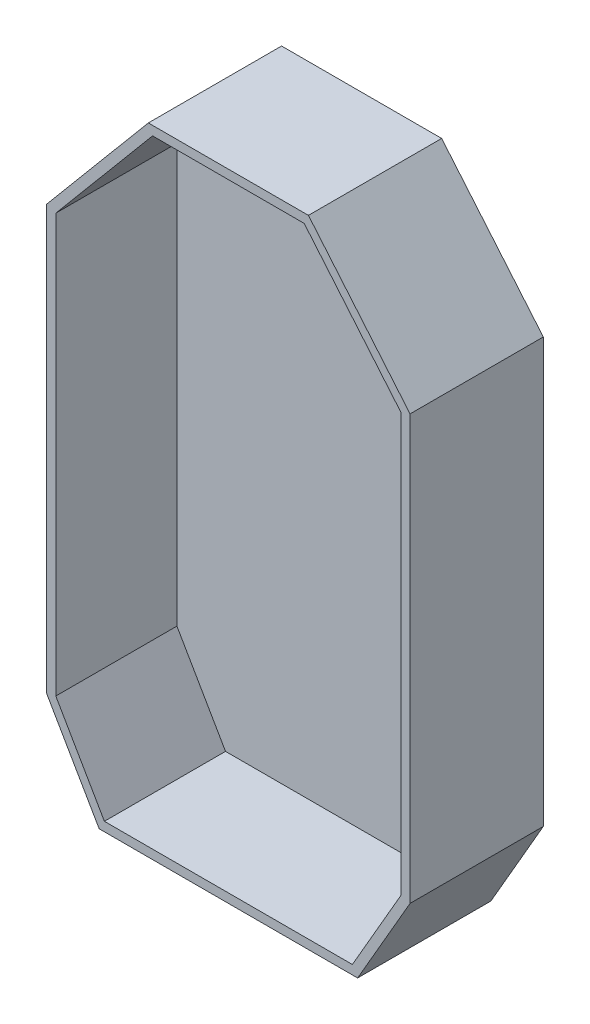
ISO-10303-21;
HEADER;
FILE_DESCRIPTION(('STEP AP214'),'2;1');
FILE_NAME('part.step','',(''),(''),'','','');
FILE_SCHEMA(('AUTOMOTIVE_DESIGN { 1 0 10303 214 1 1 1 1 }'));
ENDSEC;
DATA;
#1=APPLICATION_CONTEXT('core data for automotive mechanical design processes');
#2=APPLICATION_PROTOCOL_DEFINITION('international standard','automotive_design',2000,#1);
#3=PRODUCT_CONTEXT('',#1,'mechanical');
#4=PRODUCT('Part','Part','',(#3));
#5=PRODUCT_RELATED_PRODUCT_CATEGORY('part','',(#4));
#6=PRODUCT_DEFINITION_FORMATION('','',#4);
#7=PRODUCT_DEFINITION_CONTEXT('part definition',#1,'design');
#8=PRODUCT_DEFINITION('design','',#6,#7);
#9=PRODUCT_DEFINITION_SHAPE('','',#8);
#10=(LENGTH_UNIT() NAMED_UNIT(*) SI_UNIT(.MILLI.,.METRE.));
#11=(NAMED_UNIT(*) PLANE_ANGLE_UNIT() SI_UNIT($,.RADIAN.));
#12=(NAMED_UNIT(*) SI_UNIT($,.STERADIAN.) SOLID_ANGLE_UNIT());
#13=UNCERTAINTY_MEASURE_WITH_UNIT(LENGTH_MEASURE(1.E-05),#10,'distance_accuracy_value','');
#14=(GEOMETRIC_REPRESENTATION_CONTEXT(3) GLOBAL_UNCERTAINTY_ASSIGNED_CONTEXT((#13)) GLOBAL_UNIT_ASSIGNED_CONTEXT((#10,
#11,#12)) REPRESENTATION_CONTEXT('',''));
#15=CARTESIAN_POINT('',(0.,0.,0.));
#16=DIRECTION('',(0.,0.,1.));
#17=DIRECTION('',(1.,0.,0.));
#18=AXIS2_PLACEMENT_3D('',#15,#16,#17);
#19=CARTESIAN_POINT('',(-60.,70.,4.));
#20=DIRECTION('',(1.,0.,0.));
#21=DIRECTION('',(0.,0.,-1.));
#22=AXIS2_PLACEMENT_3D('',#19,#20,#21);
#23=PLANE('',#22);
#24=DIRECTION('',(0.,-1.,0.));
#25=VECTOR('',#24,1.);
#26=CARTESIAN_POINT('',(-60.,70.,0.));
#27=LINE('',#26,#25);
#28=CARTESIAN_POINT('',(-60.,70.,0.));
#29=VERTEX_POINT('',#28);
#30=CARTESIAN_POINT('',(-60.,-70.,0.));
#31=VERTEX_POINT('',#30);
#32=EDGE_CURVE('E278',#29,#31,#27,.T.);
#33=ORIENTED_EDGE('',*,*,#32,.T.);
#34=DIRECTION('',(0.,0.,-1.));
#35=VECTOR('',#34,1.);
#36=CARTESIAN_POINT('',(-60.,-70.,4.));
#37=LINE('',#36,#35);
#38=CARTESIAN_POINT('',(-60.,-70.,44.));
#39=VERTEX_POINT('',#38);
#40=EDGE_CURVE('E11',#39,#31,#37,.T.);
#41=ORIENTED_EDGE('',*,*,#40,.F.);
#42=DIRECTION('',(0.,-1.,0.));
#43=VECTOR('',#42,1.);
#44=CARTESIAN_POINT('',(-60.,70.,44.));
#45=LINE('',#44,#43);
#46=CARTESIAN_POINT('',(-60.,70.,44.));
#47=VERTEX_POINT('',#46);
#48=EDGE_CURVE('E254',#47,#39,#45,.T.);
#49=ORIENTED_EDGE('',*,*,#48,.F.);
#50=DIRECTION('',(0.,0.,-1.));
#51=VECTOR('',#50,1.);
#52=CARTESIAN_POINT('',(-60.,70.,4.));
#53=LINE('',#52,#51);
#54=EDGE_CURVE('E302',#47,#29,#53,.T.);
#55=ORIENTED_EDGE('',*,*,#54,.T.);
#56=EDGE_LOOP('',(#33,#41,#49,#55));
#57=FACE_BOUND('',#56,.T.);
#58=ADVANCED_FACE('F39',(#57),#23,.F.);
#59=CARTESIAN_POINT('',(-42.679491924311,-100.,4.));
#60=DIRECTION('',(0.866025403784436,0.500000000000005,0.));
#61=DIRECTION('',(-0.500000000000005,0.866025403784436,0.));
#62=AXIS2_PLACEMENT_3D('',#59,#60,#61);
#63=PLANE('',#62);
#64=DIRECTION('',(0.500000000000005,-0.866025403784436,0.));
#65=VECTOR('',#64,1.);
#66=CARTESIAN_POINT('',(-42.679491924311,-100.,0.));
#67=LINE('',#66,#65);
#68=CARTESIAN_POINT('',(-42.679491924311,-100.,0.));
#69=VERTEX_POINT('',#68);
#70=EDGE_CURVE('E282',#31,#69,#67,.T.);
#71=ORIENTED_EDGE('',*,*,#70,.T.);
#72=DIRECTION('',(0.,0.,-1.));
#73=VECTOR('',#72,1.);
#74=CARTESIAN_POINT('',(-42.679491924311,-100.,4.));
#75=LINE('',#74,#73);
#76=CARTESIAN_POINT('',(-42.679491924311,-100.,44.));
#77=VERTEX_POINT('',#76);
#78=EDGE_CURVE('E47',#77,#69,#75,.T.);
#79=ORIENTED_EDGE('',*,*,#78,.F.);
#80=DIRECTION('',(0.500000000000005,-0.866025403784436,0.));
#81=VECTOR('',#80,1.);
#82=CARTESIAN_POINT('',(-60.,-70.,44.));
#83=LINE('',#82,#81);
#84=EDGE_CURVE('E258',#39,#77,#83,.T.);
#85=ORIENTED_EDGE('',*,*,#84,.F.);
#86=ORIENTED_EDGE('',*,*,#40,.T.);
#87=EDGE_LOOP('',(#71,#79,#85,#86));
#88=FACE_BOUND('',#87,.T.);
#89=ADVANCED_FACE('F355',(#88),#63,.F.);
#90=CARTESIAN_POINT('',(42.679491924311,-100.,4.));
#91=DIRECTION('',(0.,1.,0.));
#92=DIRECTION('',(0.,0.,1.));
#93=AXIS2_PLACEMENT_3D('',#90,#91,#92);
#94=PLANE('',#93);
#95=DIRECTION('',(1.,0.,0.));
#96=VECTOR('',#95,1.);
#97=CARTESIAN_POINT('',(42.679491924311,-100.,0.));
#98=LINE('',#97,#96);
#99=CARTESIAN_POINT('',(42.679491924311,-100.,0.));
#100=VERTEX_POINT('',#99);
#101=EDGE_CURVE('E285',#69,#100,#98,.T.);
#102=ORIENTED_EDGE('',*,*,#101,.T.);
#103=DIRECTION('',(0.,0.,-1.));
#104=VECTOR('',#103,1.);
#105=CARTESIAN_POINT('',(42.679491924311,-100.,4.));
#106=LINE('',#105,#104);
#107=CARTESIAN_POINT('',(42.679491924311,-100.,44.));
#108=VERTEX_POINT('',#107);
#109=EDGE_CURVE('E320',#108,#100,#106,.T.);
#110=ORIENTED_EDGE('',*,*,#109,.F.);
#111=DIRECTION('',(1.,0.,0.));
#112=VECTOR('',#111,1.);
#113=CARTESIAN_POINT('',(-42.679491924311,-100.,44.));
#114=LINE('',#113,#112);
#115=EDGE_CURVE('E262',#77,#108,#114,.T.);
#116=ORIENTED_EDGE('',*,*,#115,.F.);
#117=ORIENTED_EDGE('',*,*,#78,.T.);
#118=EDGE_LOOP('',(#102,#110,#116,#117));
#119=FACE_BOUND('',#118,.T.);
#120=ADVANCED_FACE('F328',(#119),#94,.F.);
#121=CARTESIAN_POINT('',(42.679491924311,-100.,4.));
#122=DIRECTION('',(-0.866025403784436,0.500000000000005,0.));
#123=DIRECTION('',(-0.500000000000005,-0.866025403784436,0.));
#124=AXIS2_PLACEMENT_3D('',#121,#122,#123);
#125=PLANE('',#124);
#126=DIRECTION('',(0.500000000000005,0.866025403784436,0.));
#127=VECTOR('',#126,1.);
#128=CARTESIAN_POINT('',(42.679491924311,-100.,0.));
#129=LINE('',#128,#127);
#130=CARTESIAN_POINT('',(60.,-70.,0.));
#131=VERTEX_POINT('',#130);
#132=EDGE_CURVE('E288',#100,#131,#129,.T.);
#133=ORIENTED_EDGE('',*,*,#132,.T.);
#134=DIRECTION('',(0.,0.,-1.));
#135=VECTOR('',#134,1.);
#136=CARTESIAN_POINT('',(60.,-70.,4.));
#137=LINE('',#136,#135);
#138=CARTESIAN_POINT('',(60.,-70.,44.));
#139=VERTEX_POINT('',#138);
#140=EDGE_CURVE('E316',#139,#131,#137,.T.);
#141=ORIENTED_EDGE('',*,*,#140,.F.);
#142=DIRECTION('',(0.500000000000005,0.866025403784436,0.));
#143=VECTOR('',#142,1.);
#144=CARTESIAN_POINT('',(42.679491924311,-100.,44.));
#145=LINE('',#144,#143);
#146=EDGE_CURVE('E266',#108,#139,#145,.T.);
#147=ORIENTED_EDGE('',*,*,#146,.F.);
#148=ORIENTED_EDGE('',*,*,#109,.T.);
#149=EDGE_LOOP('',(#133,#141,#147,#148));
#150=FACE_BOUND('',#149,.T.);
#151=ADVANCED_FACE('F338',(#150),#125,.F.);
#152=CARTESIAN_POINT('',(60.,70.,4.));
#153=DIRECTION('',(-1.,0.,0.));
#154=DIRECTION('',(0.,0.,1.));
#155=AXIS2_PLACEMENT_3D('',#152,#153,#154);
#156=PLANE('',#155);
#157=DIRECTION('',(0.,1.,0.));
#158=VECTOR('',#157,1.);
#159=CARTESIAN_POINT('',(60.,70.,0.));
#160=LINE('',#159,#158);
#161=CARTESIAN_POINT('',(60.,70.,0.));
#162=VERTEX_POINT('',#161);
#163=EDGE_CURVE('E291',#131,#162,#160,.T.);
#164=ORIENTED_EDGE('',*,*,#163,.T.);
#165=DIRECTION('',(0.,0.,-1.));
#166=VECTOR('',#165,1.);
#167=CARTESIAN_POINT('',(60.,70.,4.));
#168=LINE('',#167,#166);
#169=CARTESIAN_POINT('',(60.,70.,44.));
#170=VERTEX_POINT('',#169);
#171=EDGE_CURVE('E312',#170,#162,#168,.T.);
#172=ORIENTED_EDGE('',*,*,#171,.F.);
#173=DIRECTION('',(0.,1.,0.));
#174=VECTOR('',#173,1.);
#175=CARTESIAN_POINT('',(60.,-70.,44.));
#176=LINE('',#175,#174);
#177=EDGE_CURVE('E270',#139,#170,#176,.T.);
#178=ORIENTED_EDGE('',*,*,#177,.F.);
#179=ORIENTED_EDGE('',*,*,#140,.T.);
#180=EDGE_LOOP('',(#164,#172,#178,#179));
#181=FACE_BOUND('',#180,.T.);
#182=ADVANCED_FACE('F342',(#181),#156,.F.);
#183=CARTESIAN_POINT('',(60.,70.,4.));
#184=DIRECTION('',(-0.76604444311898,-0.642787609686537,0.));
#185=DIRECTION('',(0.642787609686537,-0.76604444311898,0.));
#186=AXIS2_PLACEMENT_3D('',#183,#184,#185);
#187=PLANE('',#186);
#188=DIRECTION('',(-0.642787609686537,0.76604444311898,0.));
#189=VECTOR('',#188,1.);
#190=CARTESIAN_POINT('',(60.,70.,0.));
#191=LINE('',#190,#189);
#192=CARTESIAN_POINT('',(26.4360147529089,110.,0.));
#193=VERTEX_POINT('',#192);
#194=EDGE_CURVE('E294',#162,#193,#191,.T.);
#195=ORIENTED_EDGE('',*,*,#194,.T.);
#196=DIRECTION('',(0.,0.,-1.));
#197=VECTOR('',#196,1.);
#198=CARTESIAN_POINT('',(26.4360147529089,110.,4.));
#199=LINE('',#198,#197);
#200=CARTESIAN_POINT('',(26.4360147529089,110.,44.));
#201=VERTEX_POINT('',#200);
#202=EDGE_CURVE('E308',#201,#193,#199,.T.);
#203=ORIENTED_EDGE('',*,*,#202,.F.);
#204=DIRECTION('',(-0.642787609686537,0.76604444311898,0.));
#205=VECTOR('',#204,1.);
#206=CARTESIAN_POINT('',(60.,70.,44.));
#207=LINE('',#206,#205);
#208=EDGE_CURVE('E274',#170,#201,#207,.T.);
#209=ORIENTED_EDGE('',*,*,#208,.F.);
#210=ORIENTED_EDGE('',*,*,#171,.T.);
#211=EDGE_LOOP('',(#195,#203,#209,#210));
#212=FACE_BOUND('',#211,.T.);
#213=ADVANCED_FACE('F347',(#212),#187,.F.);
#214=CARTESIAN_POINT('',(-26.4360147529089,110.,4.));
#215=DIRECTION('',(0.,-1.,0.));
#216=DIRECTION('',(0.,0.,-1.));
#217=AXIS2_PLACEMENT_3D('',#214,#215,#216);
#218=PLANE('',#217);
#219=DIRECTION('',(-1.,0.,0.));
#220=VECTOR('',#219,1.);
#221=CARTESIAN_POINT('',(-26.4360147529089,110.,0.));
#222=LINE('',#221,#220);
#223=CARTESIAN_POINT('',(-26.4360147529089,110.,0.));
#224=VERTEX_POINT('',#223);
#225=EDGE_CURVE('E297',#193,#224,#222,.T.);
#226=ORIENTED_EDGE('',*,*,#225,.T.);
#227=DIRECTION('',(0.,0.,-1.));
#228=VECTOR('',#227,1.);
#229=CARTESIAN_POINT('',(-26.4360147529089,110.,4.));
#230=LINE('',#229,#228);
#231=CARTESIAN_POINT('',(-26.4360147529089,110.,44.));
#232=VERTEX_POINT('',#231);
#233=EDGE_CURVE('E305',#232,#224,#230,.T.);
#234=ORIENTED_EDGE('',*,*,#233,.F.);
#235=DIRECTION('',(-1.,0.,0.));
#236=VECTOR('',#235,1.);
#237=CARTESIAN_POINT('',(26.4360147529089,110.,44.));
#238=LINE('',#237,#236);
#239=EDGE_CURVE('E172',#201,#232,#238,.T.);
#240=ORIENTED_EDGE('',*,*,#239,.F.);
#241=ORIENTED_EDGE('',*,*,#202,.T.);
#242=EDGE_LOOP('',(#226,#234,#240,#241));
#243=FACE_BOUND('',#242,.T.);
#244=ADVANCED_FACE('F350',(#243),#218,.F.);
#245=CARTESIAN_POINT('',(-60.,70.,4.));
#246=DIRECTION('',(0.76604444311898,-0.642787609686537,0.));
#247=DIRECTION('',(0.642787609686537,0.76604444311898,0.));
#248=AXIS2_PLACEMENT_3D('',#245,#246,#247);
#249=PLANE('',#248);
#250=DIRECTION('',(-0.642787609686537,-0.76604444311898,0.));
#251=VECTOR('',#250,1.);
#252=CARTESIAN_POINT('',(-60.,70.,0.));
#253=LINE('',#252,#251);
#254=EDGE_CURVE('E62',#224,#29,#253,.T.);
#255=ORIENTED_EDGE('',*,*,#254,.T.);
#256=ORIENTED_EDGE('',*,*,#54,.F.);
#257=DIRECTION('',(-0.642787609686537,-0.76604444311898,0.));
#258=VECTOR('',#257,1.);
#259=CARTESIAN_POINT('',(-26.4360147529089,110.,44.));
#260=LINE('',#259,#258);
#261=EDGE_CURVE('E250',#232,#47,#260,.T.);
#262=ORIENTED_EDGE('',*,*,#261,.F.);
#263=ORIENTED_EDGE('',*,*,#233,.T.);
#264=EDGE_LOOP('',(#255,#256,#262,#263));
#265=FACE_BOUND('',#264,.T.);
#266=ADVANCED_FACE('F354',(#265),#249,.F.);
#267=CARTESIAN_POINT('',(0.,0.,0.));
#268=DIRECTION('',(0.,0.,-1.));
#269=DIRECTION('',(-1.,0.,0.));
#270=AXIS2_PLACEMENT_3D('',#267,#268,#269);
#271=PLANE('',#270);
#272=ORIENTED_EDGE('',*,*,#32,.F.);
#273=ORIENTED_EDGE('',*,*,#254,.F.);
#274=ORIENTED_EDGE('',*,*,#225,.F.);
#275=ORIENTED_EDGE('',*,*,#194,.F.);
#276=ORIENTED_EDGE('',*,*,#163,.F.);
#277=ORIENTED_EDGE('',*,*,#132,.F.);
#278=ORIENTED_EDGE('',*,*,#101,.F.);
#279=ORIENTED_EDGE('',*,*,#70,.F.);
#280=EDGE_LOOP('',(#272,#273,#274,#275,#276,#277,#278,#279));
#281=FACE_BOUND('',#280,.T.);
#282=ADVANCED_FACE('F334',(#281),#271,.T.);
#283=CARTESIAN_POINT('',(0.,0.,44.));
#284=DIRECTION('',(0.,0.,1.));
#285=DIRECTION('',(1.,0.,0.));
#286=AXIS2_PLACEMENT_3D('',#283,#284,#285);
#287=PLANE('',#286);
#288=ORIENTED_EDGE('',*,*,#239,.T.);
#289=ORIENTED_EDGE('',*,*,#261,.T.);
#290=ORIENTED_EDGE('',*,*,#48,.T.);
#291=ORIENTED_EDGE('',*,*,#84,.T.);
#292=ORIENTED_EDGE('',*,*,#115,.T.);
#293=ORIENTED_EDGE('',*,*,#146,.T.);
#294=ORIENTED_EDGE('',*,*,#177,.T.);
#295=ORIENTED_EDGE('',*,*,#208,.T.);
#296=EDGE_LOOP('',(#288,#289,#290,#291,#292,#293,#294,#295));
#297=FACE_BOUND('',#296,.T.);
#298=DIRECTION('',(-0.642787609686537,-0.76604444311898,0.));
#299=VECTOR('',#298,1.);
#300=CARTESIAN_POINT('',(-25.037091778444,107.,44.));
#301=LINE('',#300,#299);
#302=CARTESIAN_POINT('',(-25.037091778444,107.,44.));
#303=VERTEX_POINT('',#302);
#304=CARTESIAN_POINT('',(-57.,68.9080892972014,44.));
#305=VERTEX_POINT('',#304);
#306=EDGE_CURVE('E163',#303,#305,#301,.T.);
#307=ORIENTED_EDGE('',*,*,#306,.F.);
#308=DIRECTION('',(-1.,0.,0.));
#309=VECTOR('',#308,1.);
#310=CARTESIAN_POINT('',(25.0370917784439,107.,44.));
#311=LINE('',#310,#309);
#312=CARTESIAN_POINT('',(25.0370917784439,107.,44.));
#313=VERTEX_POINT('',#312);
#314=EDGE_CURVE('E154',#313,#303,#311,.T.);
#315=ORIENTED_EDGE('',*,*,#314,.F.);
#316=DIRECTION('',(-0.642787609686537,0.76604444311898,0.));
#317=VECTOR('',#316,1.);
#318=CARTESIAN_POINT('',(57.,68.9080892972014,44.));
#319=LINE('',#318,#317);
#320=CARTESIAN_POINT('',(57.,68.9080892972014,44.));
#321=VERTEX_POINT('',#320);
#322=EDGE_CURVE('E197',#321,#313,#319,.T.);
#323=ORIENTED_EDGE('',*,*,#322,.F.);
#324=DIRECTION('',(0.,1.,0.));
#325=VECTOR('',#324,1.);
#326=CARTESIAN_POINT('',(57.,-69.1961524227066,44.));
#327=LINE('',#326,#325);
#328=CARTESIAN_POINT('',(57.,-69.1961524227066,44.));
#329=VERTEX_POINT('',#328);
#330=EDGE_CURVE('E193',#329,#321,#327,.T.);
#331=ORIENTED_EDGE('',*,*,#330,.F.);
#332=DIRECTION('',(0.500000000000005,0.866025403784436,0.));
#333=VECTOR('',#332,1.);
#334=CARTESIAN_POINT('',(40.9474411167421,-97.,44.));
#335=LINE('',#334,#333);
#336=CARTESIAN_POINT('',(40.9474411167421,-97.,44.));
#337=VERTEX_POINT('',#336);
#338=EDGE_CURVE('E190',#337,#329,#335,.T.);
#339=ORIENTED_EDGE('',*,*,#338,.F.);
#340=DIRECTION('',(1.,0.,0.));
#341=VECTOR('',#340,1.);
#342=CARTESIAN_POINT('',(-40.9474411167421,-97.,44.));
#343=LINE('',#342,#341);
#344=CARTESIAN_POINT('',(-40.9474411167421,-97.,44.));
#345=VERTEX_POINT('',#344);
#346=EDGE_CURVE('E187',#345,#337,#343,.T.);
#347=ORIENTED_EDGE('',*,*,#346,.F.);
#348=DIRECTION('',(0.500000000000005,-0.866025403784436,0.));
#349=VECTOR('',#348,1.);
#350=CARTESIAN_POINT('',(-57.,-69.1961524227067,44.));
#351=LINE('',#350,#349);
#352=CARTESIAN_POINT('',(-57.,-69.1961524227067,44.));
#353=VERTEX_POINT('',#352);
#354=EDGE_CURVE('E182',#353,#345,#351,.T.);
#355=ORIENTED_EDGE('',*,*,#354,.F.);
#356=DIRECTION('',(0.,-1.,0.));
#357=VECTOR('',#356,1.);
#358=CARTESIAN_POINT('',(-57.,68.9080892972014,44.));
#359=LINE('',#358,#357);
#360=EDGE_CURVE('E178',#305,#353,#359,.T.);
#361=ORIENTED_EDGE('',*,*,#360,.F.);
#362=EDGE_LOOP('',(#307,#315,#323,#331,#339,#347,#355,#361));
#363=FACE_BOUND('',#362,.T.);
#364=ADVANCED_FACE('F176',(#297,#363),#287,.T.);
#365=CARTESIAN_POINT('',(25.0370917784439,107.,44.));
#366=DIRECTION('',(0.,-1.,0.));
#367=DIRECTION('',(1.,0.,0.));
#368=AXIS2_PLACEMENT_3D('',#365,#366,#367);
#369=PLANE('',#368);
#370=DIRECTION('',(-1.,0.,0.));
#371=VECTOR('',#370,1.);
#372=CARTESIAN_POINT('',(25.0370917784439,107.,4.));
#373=LINE('',#372,#371);
#374=CARTESIAN_POINT('',(25.037091778444,107.,4.));
#375=VERTEX_POINT('',#374);
#376=CARTESIAN_POINT('',(-25.037091778444,107.,4.));
#377=VERTEX_POINT('',#376);
#378=EDGE_CURVE('E200',#375,#377,#373,.T.);
#379=ORIENTED_EDGE('',*,*,#378,.F.);
#380=DIRECTION('',(0.,0.,-1.));
#381=VECTOR('',#380,1.);
#382=CARTESIAN_POINT('',(25.0370917784439,107.,44.));
#383=LINE('',#382,#381);
#384=EDGE_CURVE('E54',#313,#375,#383,.T.);
#385=ORIENTED_EDGE('',*,*,#384,.F.);
#386=ORIENTED_EDGE('',*,*,#314,.T.);
#387=DIRECTION('',(0.,0.,-1.));
#388=VECTOR('',#387,1.);
#389=CARTESIAN_POINT('',(-25.037091778444,107.,44.));
#390=LINE('',#389,#388);
#391=EDGE_CURVE('E157',#303,#377,#390,.T.);
#392=ORIENTED_EDGE('',*,*,#391,.T.);
#393=EDGE_LOOP('',(#379,#385,#386,#392));
#394=FACE_BOUND('',#393,.T.);
#395=ADVANCED_FACE('F156',(#394),#369,.T.);
#396=CARTESIAN_POINT('',(-25.037091778444,107.,44.));
#397=DIRECTION('',(0.76604444311898,-0.642787609686537,0.));
#398=DIRECTION('',(0.642787609686537,0.76604444311898,0.));
#399=AXIS2_PLACEMENT_3D('',#396,#397,#398);
#400=PLANE('',#399);
#401=DIRECTION('',(-0.642787609686537,-0.76604444311898,0.));
#402=VECTOR('',#401,1.);
#403=CARTESIAN_POINT('',(-25.037091778444,107.,4.));
#404=LINE('',#403,#402);
#405=CARTESIAN_POINT('',(-57.,68.9080892972014,4.));
#406=VERTEX_POINT('',#405);
#407=EDGE_CURVE('E170',#377,#406,#404,.T.);
#408=ORIENTED_EDGE('',*,*,#407,.F.);
#409=ORIENTED_EDGE('',*,*,#391,.F.);
#410=ORIENTED_EDGE('',*,*,#306,.T.);
#411=DIRECTION('',(0.,0.,-1.));
#412=VECTOR('',#411,1.);
#413=CARTESIAN_POINT('',(-57.,68.9080892972014,44.));
#414=LINE('',#413,#412);
#415=EDGE_CURVE('E173',#305,#406,#414,.T.);
#416=ORIENTED_EDGE('',*,*,#415,.T.);
#417=EDGE_LOOP('',(#408,#409,#410,#416));
#418=FACE_BOUND('',#417,.T.);
#419=ADVANCED_FACE('F167',(#418),#400,.T.);
#420=CARTESIAN_POINT('',(-57.,68.9080892972014,44.));
#421=DIRECTION('',(1.,0.,0.));
#422=DIRECTION('',(0.,1.,0.));
#423=AXIS2_PLACEMENT_3D('',#420,#421,#422);
#424=PLANE('',#423);
#425=DIRECTION('',(0.,-1.,0.));
#426=VECTOR('',#425,1.);
#427=CARTESIAN_POINT('',(-57.,68.9080892972014,4.));
#428=LINE('',#427,#426);
#429=CARTESIAN_POINT('',(-57.,-69.1961524227067,4.));
#430=VERTEX_POINT('',#429);
#431=EDGE_CURVE('E205',#406,#430,#428,.T.);
#432=ORIENTED_EDGE('',*,*,#431,.F.);
#433=ORIENTED_EDGE('',*,*,#415,.F.);
#434=ORIENTED_EDGE('',*,*,#360,.T.);
#435=DIRECTION('',(0.,0.,-1.));
#436=VECTOR('',#435,1.);
#437=CARTESIAN_POINT('',(-57.,-69.1961524227067,44.));
#438=LINE('',#437,#436);
#439=EDGE_CURVE('E242',#353,#430,#438,.T.);
#440=ORIENTED_EDGE('',*,*,#439,.T.);
#441=EDGE_LOOP('',(#432,#433,#434,#440));
#442=FACE_BOUND('',#441,.T.);
#443=ADVANCED_FACE('F386',(#442),#424,.T.);
#444=CARTESIAN_POINT('',(-57.,-69.1961524227067,44.));
#445=DIRECTION('',(0.866025403784436,0.500000000000005,0.));
#446=DIRECTION('',(-0.500000000000005,0.866025403784436,0.));
#447=AXIS2_PLACEMENT_3D('',#444,#445,#446);
#448=PLANE('',#447);
#449=DIRECTION('',(0.500000000000005,-0.866025403784436,0.));
#450=VECTOR('',#449,1.);
#451=CARTESIAN_POINT('',(-57.,-69.1961524227067,4.));
#452=LINE('',#451,#450);
#453=CARTESIAN_POINT('',(-40.9474411167421,-97.,4.));
#454=VERTEX_POINT('',#453);
#455=EDGE_CURVE('E209',#430,#454,#452,.T.);
#456=ORIENTED_EDGE('',*,*,#455,.F.);
#457=ORIENTED_EDGE('',*,*,#439,.F.);
#458=ORIENTED_EDGE('',*,*,#354,.T.);
#459=DIRECTION('',(0.,0.,-1.));
#460=VECTOR('',#459,1.);
#461=CARTESIAN_POINT('',(-40.9474411167421,-97.,44.));
#462=LINE('',#461,#460);
#463=EDGE_CURVE('E239',#345,#454,#462,.T.);
#464=ORIENTED_EDGE('',*,*,#463,.T.);
#465=EDGE_LOOP('',(#456,#457,#458,#464));
#466=FACE_BOUND('',#465,.T.);
#467=ADVANCED_FACE('F389',(#466),#448,.T.);
#468=CARTESIAN_POINT('',(-40.9474411167421,-97.,44.));
#469=DIRECTION('',(0.,1.,0.));
#470=DIRECTION('',(0.,0.,1.));
#471=AXIS2_PLACEMENT_3D('',#468,#469,#470);
#472=PLANE('',#471);
#473=DIRECTION('',(1.,0.,0.));
#474=VECTOR('',#473,1.);
#475=CARTESIAN_POINT('',(-40.9474411167421,-97.,4.));
#476=LINE('',#475,#474);
#477=CARTESIAN_POINT('',(40.9474411167421,-97.,4.));
#478=VERTEX_POINT('',#477);
#479=EDGE_CURVE('E213',#454,#478,#476,.T.);
#480=ORIENTED_EDGE('',*,*,#479,.F.);
#481=ORIENTED_EDGE('',*,*,#463,.F.);
#482=ORIENTED_EDGE('',*,*,#346,.T.);
#483=DIRECTION('',(0.,0.,-1.));
#484=VECTOR('',#483,1.);
#485=CARTESIAN_POINT('',(40.9474411167421,-97.,44.));
#486=LINE('',#485,#484);
#487=EDGE_CURVE('E236',#337,#478,#486,.T.);
#488=ORIENTED_EDGE('',*,*,#487,.T.);
#489=EDGE_LOOP('',(#480,#481,#482,#488));
#490=FACE_BOUND('',#489,.T.);
#491=ADVANCED_FACE('F393',(#490),#472,.T.);
#492=CARTESIAN_POINT('',(40.9474411167421,-97.,44.));
#493=DIRECTION('',(-0.866025403784436,0.500000000000005,0.));
#494=DIRECTION('',(-0.500000000000005,-0.866025403784436,0.));
#495=AXIS2_PLACEMENT_3D('',#492,#493,#494);
#496=PLANE('',#495);
#497=DIRECTION('',(0.500000000000005,0.866025403784436,0.));
#498=VECTOR('',#497,1.);
#499=CARTESIAN_POINT('',(40.9474411167421,-97.,4.));
#500=LINE('',#499,#498);
#501=CARTESIAN_POINT('',(57.,-69.1961524227066,4.));
#502=VERTEX_POINT('',#501);
#503=EDGE_CURVE('E217',#478,#502,#500,.T.);
#504=ORIENTED_EDGE('',*,*,#503,.F.);
#505=ORIENTED_EDGE('',*,*,#487,.F.);
#506=ORIENTED_EDGE('',*,*,#338,.T.);
#507=DIRECTION('',(0.,0.,-1.));
#508=VECTOR('',#507,1.);
#509=CARTESIAN_POINT('',(57.,-69.1961524227066,44.));
#510=LINE('',#509,#508);
#511=EDGE_CURVE('E233',#329,#502,#510,.T.);
#512=ORIENTED_EDGE('',*,*,#511,.T.);
#513=EDGE_LOOP('',(#504,#505,#506,#512));
#514=FACE_BOUND('',#513,.T.);
#515=ADVANCED_FACE('F397',(#514),#496,.T.);
#516=CARTESIAN_POINT('',(57.,-69.1961524227066,44.));
#517=DIRECTION('',(-1.,0.,0.));
#518=DIRECTION('',(0.,0.,1.));
#519=AXIS2_PLACEMENT_3D('',#516,#517,#518);
#520=PLANE('',#519);
#521=DIRECTION('',(0.,1.,0.));
#522=VECTOR('',#521,1.);
#523=CARTESIAN_POINT('',(57.,-69.1961524227066,4.));
#524=LINE('',#523,#522);
#525=CARTESIAN_POINT('',(57.,68.9080892972014,4.));
#526=VERTEX_POINT('',#525);
#527=EDGE_CURVE('E221',#502,#526,#524,.T.);
#528=ORIENTED_EDGE('',*,*,#527,.F.);
#529=ORIENTED_EDGE('',*,*,#511,.F.);
#530=ORIENTED_EDGE('',*,*,#330,.T.);
#531=DIRECTION('',(0.,0.,-1.));
#532=VECTOR('',#531,1.);
#533=CARTESIAN_POINT('',(57.,68.9080892972014,44.));
#534=LINE('',#533,#532);
#535=EDGE_CURVE('E230',#321,#526,#534,.T.);
#536=ORIENTED_EDGE('',*,*,#535,.T.);
#537=EDGE_LOOP('',(#528,#529,#530,#536));
#538=FACE_BOUND('',#537,.T.);
#539=ADVANCED_FACE('F401',(#538),#520,.T.);
#540=CARTESIAN_POINT('',(57.,68.9080892972014,44.));
#541=DIRECTION('',(-0.76604444311898,-0.642787609686537,0.));
#542=DIRECTION('',(0.642787609686537,-0.76604444311898,0.));
#543=AXIS2_PLACEMENT_3D('',#540,#541,#542);
#544=PLANE('',#543);
#545=DIRECTION('',(-0.642787609686537,0.76604444311898,0.));
#546=VECTOR('',#545,1.);
#547=CARTESIAN_POINT('',(57.,68.9080892972014,4.));
#548=LINE('',#547,#546);
#549=EDGE_CURVE('E164',#526,#375,#548,.T.);
#550=ORIENTED_EDGE('',*,*,#549,.F.);
#551=ORIENTED_EDGE('',*,*,#535,.F.);
#552=ORIENTED_EDGE('',*,*,#322,.T.);
#553=ORIENTED_EDGE('',*,*,#384,.T.);
#554=EDGE_LOOP('',(#550,#551,#552,#553));
#555=FACE_BOUND('',#554,.T.);
#556=ADVANCED_FACE('F378',(#555),#544,.T.);
#557=CARTESIAN_POINT('',(0.,0.,4.));
#558=DIRECTION('',(0.,0.,-1.));
#559=DIRECTION('',(-1.,0.,0.));
#560=AXIS2_PLACEMENT_3D('',#557,#558,#559);
#561=PLANE('',#560);
#562=ORIENTED_EDGE('',*,*,#549,.T.);
#563=ORIENTED_EDGE('',*,*,#378,.T.);
#564=ORIENTED_EDGE('',*,*,#407,.T.);
#565=ORIENTED_EDGE('',*,*,#431,.T.);
#566=ORIENTED_EDGE('',*,*,#455,.T.);
#567=ORIENTED_EDGE('',*,*,#479,.T.);
#568=ORIENTED_EDGE('',*,*,#503,.T.);
#569=ORIENTED_EDGE('',*,*,#527,.T.);
#570=EDGE_LOOP('',(#562,#563,#564,#565,#566,#567,#568,#569));
#571=FACE_BOUND('',#570,.T.);
#572=ADVANCED_FACE('F375',(#571),#561,.F.);
#573=CLOSED_SHELL('',(#58,#89,#120,#151,#182,#213,#244,#266,#282,#364,#395,#419,#443,#467,#491,
#515,#539,#556,#572));
#574=MANIFOLD_SOLID_BREP('B2',#573);
#575=ADVANCED_BREP_SHAPE_REPRESENTATION('',(#18,#574),#14);
#576=SHAPE_DEFINITION_REPRESENTATION(#9,#575);
ENDSEC;
END-ISO-10303-21;
